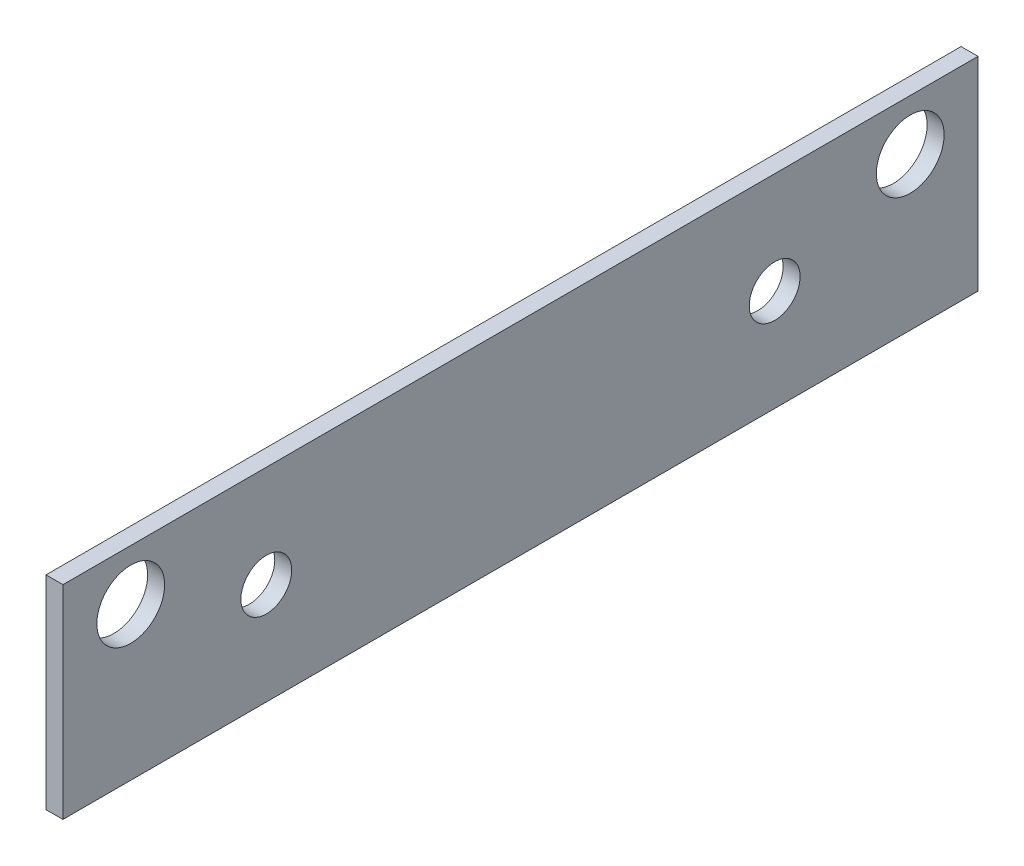
ISO-10303-21;
HEADER;
FILE_DESCRIPTION(('STEP AP214'),'2;1');
FILE_NAME('part.step','',(''),(''),'','','');
FILE_SCHEMA(('AUTOMOTIVE_DESIGN { 1 0 10303 214 1 1 1 1 }'));
ENDSEC;
DATA;
#1=APPLICATION_CONTEXT('core data for automotive mechanical design processes');
#2=APPLICATION_PROTOCOL_DEFINITION('international standard','automotive_design',2000,#1);
#3=PRODUCT_CONTEXT('',#1,'mechanical');
#4=PRODUCT('Part','Part','',(#3));
#5=PRODUCT_RELATED_PRODUCT_CATEGORY('part','',(#4));
#6=PRODUCT_DEFINITION_FORMATION('','',#4);
#7=PRODUCT_DEFINITION_CONTEXT('part definition',#1,'design');
#8=PRODUCT_DEFINITION('design','',#6,#7);
#9=PRODUCT_DEFINITION_SHAPE('','',#8);
#10=(LENGTH_UNIT() NAMED_UNIT(*) SI_UNIT(.MILLI.,.METRE.));
#11=(NAMED_UNIT(*) PLANE_ANGLE_UNIT() SI_UNIT($,.RADIAN.));
#12=(NAMED_UNIT(*) SI_UNIT($,.STERADIAN.) SOLID_ANGLE_UNIT());
#13=UNCERTAINTY_MEASURE_WITH_UNIT(LENGTH_MEASURE(1.E-05),#10,'distance_accuracy_value','');
#14=(GEOMETRIC_REPRESENTATION_CONTEXT(3) GLOBAL_UNCERTAINTY_ASSIGNED_CONTEXT((#13)) GLOBAL_UNIT_ASSIGNED_CONTEXT((#10,
#11,#12)) REPRESENTATION_CONTEXT('',''));
#15=CARTESIAN_POINT('',(0.,0.,0.));
#16=DIRECTION('',(0.,0.,1.));
#17=DIRECTION('',(1.,0.,0.));
#18=AXIS2_PLACEMENT_3D('',#15,#16,#17);
#19=CARTESIAN_POINT('',(-2.5,-30.,270.));
#20=DIRECTION('',(1.,0.,0.));
#21=DIRECTION('',(0.,0.,-1.));
#22=AXIS2_PLACEMENT_3D('',#19,#20,#21);
#23=PLANE('',#22);
#24=CARTESIAN_POINT('',(-2.5,15.,20.));
#25=DIRECTION('',(1.,0.,0.));
#26=DIRECTION('',(0.,0.,-1.));
#27=AXIS2_PLACEMENT_3D('',#24,#25,#26);
#28=CIRCLE('',#27,10.);
#29=CARTESIAN_POINT('',(-2.5,15.,10.));
#30=VERTEX_POINT('',#29);
#31=EDGE_CURVE('E126',#30,#30,#28,.F.);
#32=ORIENTED_EDGE('',*,*,#31,.F.);
#33=EDGE_LOOP('',(#32));
#34=FACE_BOUND('',#33,.T.);
#35=CARTESIAN_POINT('',(-2.5,15.,250.));
#36=DIRECTION('',(1.,0.,0.));
#37=DIRECTION('',(0.,0.,-1.));
#38=AXIS2_PLACEMENT_3D('',#35,#36,#37);
#39=CIRCLE('',#38,10.);
#40=CARTESIAN_POINT('',(-2.5,15.,240.));
#41=VERTEX_POINT('',#40);
#42=EDGE_CURVE('E125',#41,#41,#39,.F.);
#43=ORIENTED_EDGE('',*,*,#42,.F.);
#44=EDGE_LOOP('',(#43));
#45=FACE_BOUND('',#44,.T.);
#46=CARTESIAN_POINT('',(-2.5,0.,210.));
#47=DIRECTION('',(1.,0.,0.));
#48=DIRECTION('',(0.,0.,-1.));
#49=AXIS2_PLACEMENT_3D('',#46,#47,#48);
#50=CIRCLE('',#49,7.50000000000001);
#51=CARTESIAN_POINT('',(-2.5,0.,202.5));
#52=VERTEX_POINT('',#51);
#53=EDGE_CURVE('E132',#52,#52,#50,.F.);
#54=ORIENTED_EDGE('',*,*,#53,.F.);
#55=EDGE_LOOP('',(#54));
#56=FACE_BOUND('',#55,.T.);
#57=CARTESIAN_POINT('',(-2.5,0.,60.));
#58=DIRECTION('',(1.,0.,0.));
#59=DIRECTION('',(0.,0.,-1.));
#60=AXIS2_PLACEMENT_3D('',#57,#58,#59);
#61=CIRCLE('',#60,7.5);
#62=CARTESIAN_POINT('',(-2.5,0.,52.5));
#63=VERTEX_POINT('',#62);
#64=EDGE_CURVE('E105',#63,#63,#61,.F.);
#65=ORIENTED_EDGE('',*,*,#64,.F.);
#66=EDGE_LOOP('',(#65));
#67=FACE_BOUND('',#66,.T.);
#68=DIRECTION('',(0.,-1.,0.));
#69=VECTOR('',#68,1.);
#70=CARTESIAN_POINT('',(-2.5,-30.,0.));
#71=LINE('',#70,#69);
#72=CARTESIAN_POINT('',(-2.5,30.,0.));
#73=VERTEX_POINT('',#72);
#74=CARTESIAN_POINT('',(-2.5,-30.,0.));
#75=VERTEX_POINT('',#74);
#76=EDGE_CURVE('E102',#73,#75,#71,.T.);
#77=ORIENTED_EDGE('',*,*,#76,.T.);
#78=DIRECTION('',(0.,0.,-1.));
#79=VECTOR('',#78,1.);
#80=CARTESIAN_POINT('',(-2.5,-30.,270.));
#81=LINE('',#80,#79);
#82=CARTESIAN_POINT('',(-2.5,-30.,270.));
#83=VERTEX_POINT('',#82);
#84=EDGE_CURVE('E11',#83,#75,#81,.T.);
#85=ORIENTED_EDGE('',*,*,#84,.F.);
#86=DIRECTION('',(0.,-1.,0.));
#87=VECTOR('',#86,1.);
#88=CARTESIAN_POINT('',(-2.5,-30.,270.));
#89=LINE('',#88,#87);
#90=CARTESIAN_POINT('',(-2.5,30.,270.));
#91=VERTEX_POINT('',#90);
#92=EDGE_CURVE('E90',#91,#83,#89,.T.);
#93=ORIENTED_EDGE('',*,*,#92,.F.);
#94=DIRECTION('',(0.,0.,-1.));
#95=VECTOR('',#94,1.);
#96=CARTESIAN_POINT('',(-2.5,30.,270.));
#97=LINE('',#96,#95);
#98=EDGE_CURVE('E98',#91,#73,#97,.T.);
#99=ORIENTED_EDGE('',*,*,#98,.T.);
#100=EDGE_LOOP('',(#77,#85,#93,#99));
#101=FACE_BOUND('',#100,.T.);
#102=ADVANCED_FACE('F39',(#34,#45,#56,#67,#101),#23,.F.);
#103=CARTESIAN_POINT('',(2.5,-30.,270.));
#104=DIRECTION('',(0.,1.,0.));
#105=DIRECTION('',(0.,0.,1.));
#106=AXIS2_PLACEMENT_3D('',#103,#104,#105);
#107=PLANE('',#106);
#108=DIRECTION('',(1.,0.,0.));
#109=VECTOR('',#108,1.);
#110=CARTESIAN_POINT('',(2.5,-30.,0.));
#111=LINE('',#110,#109);
#112=CARTESIAN_POINT('',(2.5,-30.,0.));
#113=VERTEX_POINT('',#112);
#114=EDGE_CURVE('E94',#75,#113,#111,.T.);
#115=ORIENTED_EDGE('',*,*,#114,.T.);
#116=DIRECTION('',(0.,0.,-1.));
#117=VECTOR('',#116,1.);
#118=CARTESIAN_POINT('',(2.5,-30.,270.));
#119=LINE('',#118,#117);
#120=CARTESIAN_POINT('',(2.5,-30.,270.));
#121=VERTEX_POINT('',#120);
#122=EDGE_CURVE('E47',#121,#113,#119,.T.);
#123=ORIENTED_EDGE('',*,*,#122,.F.);
#124=DIRECTION('',(1.,0.,0.));
#125=VECTOR('',#124,1.);
#126=CARTESIAN_POINT('',(2.5,-30.,270.));
#127=LINE('',#126,#125);
#128=EDGE_CURVE('E85',#83,#121,#127,.T.);
#129=ORIENTED_EDGE('',*,*,#128,.F.);
#130=ORIENTED_EDGE('',*,*,#84,.T.);
#131=EDGE_LOOP('',(#115,#123,#129,#130));
#132=FACE_BOUND('',#131,.T.);
#133=ADVANCED_FACE('F93',(#132),#107,.F.);
#134=CARTESIAN_POINT('',(2.5,-30.,270.));
#135=DIRECTION('',(-1.,0.,0.));
#136=DIRECTION('',(0.,0.,1.));
#137=AXIS2_PLACEMENT_3D('',#134,#135,#136);
#138=PLANE('',#137);
#139=CARTESIAN_POINT('',(2.5,15.,20.));
#140=DIRECTION('',(1.,0.,0.));
#141=DIRECTION('',(0.,0.,-1.));
#142=AXIS2_PLACEMENT_3D('',#139,#140,#141);
#143=CIRCLE('',#142,10.);
#144=CARTESIAN_POINT('',(2.5,15.,10.));
#145=VERTEX_POINT('',#144);
#146=EDGE_CURVE('E122',#145,#145,#143,.T.);
#147=ORIENTED_EDGE('',*,*,#146,.F.);
#148=EDGE_LOOP('',(#147));
#149=FACE_BOUND('',#148,.T.);
#150=CARTESIAN_POINT('',(2.5,15.,250.));
#151=DIRECTION('',(1.,0.,0.));
#152=DIRECTION('',(0.,0.,-1.));
#153=AXIS2_PLACEMENT_3D('',#150,#151,#152);
#154=CIRCLE('',#153,10.);
#155=CARTESIAN_POINT('',(2.5,15.,240.));
#156=VERTEX_POINT('',#155);
#157=EDGE_CURVE('E129',#156,#156,#154,.T.);
#158=ORIENTED_EDGE('',*,*,#157,.F.);
#159=EDGE_LOOP('',(#158));
#160=FACE_BOUND('',#159,.T.);
#161=CARTESIAN_POINT('',(2.5,0.,210.));
#162=DIRECTION('',(1.,0.,0.));
#163=DIRECTION('',(0.,0.,-1.));
#164=AXIS2_PLACEMENT_3D('',#161,#162,#163);
#165=CIRCLE('',#164,7.50000000000001);
#166=CARTESIAN_POINT('',(2.5,0.,202.5));
#167=VERTEX_POINT('',#166);
#168=EDGE_CURVE('E121',#167,#167,#165,.T.);
#169=ORIENTED_EDGE('',*,*,#168,.F.);
#170=EDGE_LOOP('',(#169));
#171=FACE_BOUND('',#170,.T.);
#172=CARTESIAN_POINT('',(2.5,0.,60.));
#173=DIRECTION('',(1.,0.,0.));
#174=DIRECTION('',(0.,0.,-1.));
#175=AXIS2_PLACEMENT_3D('',#172,#173,#174);
#176=CIRCLE('',#175,7.5);
#177=CARTESIAN_POINT('',(2.5,0.,52.5));
#178=VERTEX_POINT('',#177);
#179=EDGE_CURVE('E118',#178,#178,#176,.T.);
#180=ORIENTED_EDGE('',*,*,#179,.F.);
#181=EDGE_LOOP('',(#180));
#182=FACE_BOUND('',#181,.T.);
#183=DIRECTION('',(0.,1.,0.));
#184=VECTOR('',#183,1.);
#185=CARTESIAN_POINT('',(2.5,-30.,0.));
#186=LINE('',#185,#184);
#187=CARTESIAN_POINT('',(2.5,30.,0.));
#188=VERTEX_POINT('',#187);
#189=EDGE_CURVE('E72',#113,#188,#186,.T.);
#190=ORIENTED_EDGE('',*,*,#189,.T.);
#191=DIRECTION('',(0.,0.,-1.));
#192=VECTOR('',#191,1.);
#193=CARTESIAN_POINT('',(2.5,30.,270.));
#194=LINE('',#193,#192);
#195=CARTESIAN_POINT('',(2.5,30.,270.));
#196=VERTEX_POINT('',#195);
#197=EDGE_CURVE('E95',#196,#188,#194,.T.);
#198=ORIENTED_EDGE('',*,*,#197,.F.);
#199=DIRECTION('',(0.,1.,0.));
#200=VECTOR('',#199,1.);
#201=CARTESIAN_POINT('',(2.5,-30.,270.));
#202=LINE('',#201,#200);
#203=EDGE_CURVE('E88',#121,#196,#202,.T.);
#204=ORIENTED_EDGE('',*,*,#203,.F.);
#205=ORIENTED_EDGE('',*,*,#122,.T.);
#206=EDGE_LOOP('',(#190,#198,#204,#205));
#207=FACE_BOUND('',#206,.T.);
#208=ADVANCED_FACE('F96',(#149,#160,#171,#182,#207),#138,.F.);
#209=CARTESIAN_POINT('',(2.5,30.,270.));
#210=DIRECTION('',(0.,-1.,0.));
#211=DIRECTION('',(0.,0.,-1.));
#212=AXIS2_PLACEMENT_3D('',#209,#210,#211);
#213=PLANE('',#212);
#214=DIRECTION('',(-1.,0.,0.));
#215=VECTOR('',#214,1.);
#216=CARTESIAN_POINT('',(2.5,30.,0.));
#217=LINE('',#216,#215);
#218=EDGE_CURVE('E78',#188,#73,#217,.T.);
#219=ORIENTED_EDGE('',*,*,#218,.T.);
#220=ORIENTED_EDGE('',*,*,#98,.F.);
#221=DIRECTION('',(-1.,0.,0.));
#222=VECTOR('',#221,1.);
#223=CARTESIAN_POINT('',(2.5,30.,270.));
#224=LINE('',#223,#222);
#225=EDGE_CURVE('E55',#196,#91,#224,.T.);
#226=ORIENTED_EDGE('',*,*,#225,.F.);
#227=ORIENTED_EDGE('',*,*,#197,.T.);
#228=EDGE_LOOP('',(#219,#220,#226,#227));
#229=FACE_BOUND('',#228,.T.);
#230=ADVANCED_FACE('F110',(#229),#213,.F.);
#231=CARTESIAN_POINT('',(0.,0.,270.));
#232=DIRECTION('',(0.,0.,1.));
#233=DIRECTION('',(1.,0.,0.));
#234=AXIS2_PLACEMENT_3D('',#231,#232,#233);
#235=PLANE('',#234);
#236=ORIENTED_EDGE('',*,*,#92,.T.);
#237=ORIENTED_EDGE('',*,*,#128,.T.);
#238=ORIENTED_EDGE('',*,*,#203,.T.);
#239=ORIENTED_EDGE('',*,*,#225,.T.);
#240=EDGE_LOOP('',(#236,#237,#238,#239));
#241=FACE_BOUND('',#240,.T.);
#242=ADVANCED_FACE('F86',(#241),#235,.T.);
#243=CARTESIAN_POINT('',(0.,0.,0.));
#244=DIRECTION('',(0.,0.,1.));
#245=DIRECTION('',(1.,0.,0.));
#246=AXIS2_PLACEMENT_3D('',#243,#244,#245);
#247=PLANE('',#246);
#248=ORIENTED_EDGE('',*,*,#76,.F.);
#249=ORIENTED_EDGE('',*,*,#218,.F.);
#250=ORIENTED_EDGE('',*,*,#189,.F.);
#251=ORIENTED_EDGE('',*,*,#114,.F.);
#252=EDGE_LOOP('',(#248,#249,#250,#251));
#253=FACE_BOUND('',#252,.T.);
#254=ADVANCED_FACE('F113',(#253),#247,.F.);
#255=CARTESIAN_POINT('',(-2.501,0.,60.));
#256=DIRECTION('',(1.,0.,0.));
#257=DIRECTION('',(0.,0.,-1.));
#258=AXIS2_PLACEMENT_3D('',#255,#256,#257);
#259=CYLINDRICAL_SURFACE('',#258,7.5);
#260=ORIENTED_EDGE('',*,*,#179,.T.);
#261=EDGE_LOOP('',(#260));
#262=FACE_BOUND('',#261,.T.);
#263=ORIENTED_EDGE('',*,*,#64,.T.);
#264=EDGE_LOOP('',(#263));
#265=FACE_BOUND('',#264,.T.);
#266=ADVANCED_FACE('F147',(#262,#265),#259,.F.);
#267=CARTESIAN_POINT('',(-2.501,0.,210.));
#268=DIRECTION('',(1.,0.,0.));
#269=DIRECTION('',(0.,0.,-1.));
#270=AXIS2_PLACEMENT_3D('',#267,#268,#269);
#271=CYLINDRICAL_SURFACE('',#270,7.50000000000001);
#272=ORIENTED_EDGE('',*,*,#168,.T.);
#273=EDGE_LOOP('',(#272));
#274=FACE_BOUND('',#273,.T.);
#275=ORIENTED_EDGE('',*,*,#53,.T.);
#276=EDGE_LOOP('',(#275));
#277=FACE_BOUND('',#276,.T.);
#278=ADVANCED_FACE('F140',(#274,#277),#271,.F.);
#279=CARTESIAN_POINT('',(-2.501,15.,250.));
#280=DIRECTION('',(1.,0.,0.));
#281=DIRECTION('',(0.,0.,-1.));
#282=AXIS2_PLACEMENT_3D('',#279,#280,#281);
#283=CYLINDRICAL_SURFACE('',#282,10.);
#284=ORIENTED_EDGE('',*,*,#157,.T.);
#285=EDGE_LOOP('',(#284));
#286=FACE_BOUND('',#285,.T.);
#287=ORIENTED_EDGE('',*,*,#42,.T.);
#288=EDGE_LOOP('',(#287));
#289=FACE_BOUND('',#288,.T.);
#290=ADVANCED_FACE('F155',(#286,#289),#283,.F.);
#291=CARTESIAN_POINT('',(-2.501,15.,20.));
#292=DIRECTION('',(1.,0.,0.));
#293=DIRECTION('',(0.,0.,-1.));
#294=AXIS2_PLACEMENT_3D('',#291,#292,#293);
#295=CYLINDRICAL_SURFACE('',#294,10.);
#296=ORIENTED_EDGE('',*,*,#146,.T.);
#297=EDGE_LOOP('',(#296));
#298=FACE_BOUND('',#297,.T.);
#299=ORIENTED_EDGE('',*,*,#31,.T.);
#300=EDGE_LOOP('',(#299));
#301=FACE_BOUND('',#300,.T.);
#302=ADVANCED_FACE('F162',(#298,#301),#295,.F.);
#303=CLOSED_SHELL('',(#102,#133,#208,#230,#242,#254,#266,#278,#290,#302));
#304=MANIFOLD_SOLID_BREP('B2',#303);
#305=ADVANCED_BREP_SHAPE_REPRESENTATION('',(#18,#304),#14);
#306=SHAPE_DEFINITION_REPRESENTATION(#9,#305);
ENDSEC;
END-ISO-10303-21;
